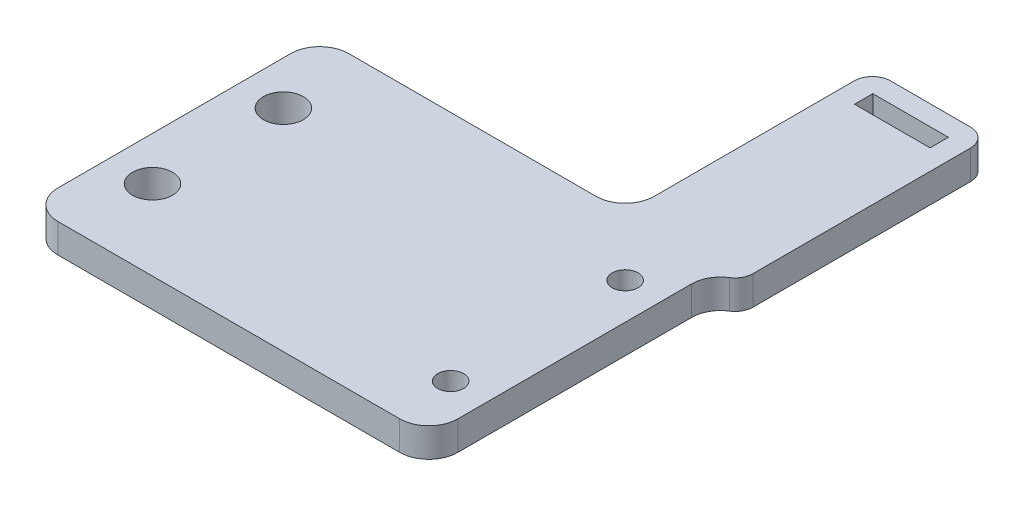
ISO-10303-21;
HEADER;
FILE_DESCRIPTION(('STEP AP214'),'2;1');
FILE_NAME('part.step','',(''),(''),'','','');
FILE_SCHEMA(('AUTOMOTIVE_DESIGN { 1 0 10303 214 1 1 1 1 }'));
ENDSEC;
DATA;
#1=APPLICATION_CONTEXT('core data for automotive mechanical design processes');
#2=APPLICATION_PROTOCOL_DEFINITION('international standard','automotive_design',2000,#1);
#3=PRODUCT_CONTEXT('',#1,'mechanical');
#4=PRODUCT('Part','Part','',(#3));
#5=PRODUCT_RELATED_PRODUCT_CATEGORY('part','',(#4));
#6=PRODUCT_DEFINITION_FORMATION('','',#4);
#7=PRODUCT_DEFINITION_CONTEXT('part definition',#1,'design');
#8=PRODUCT_DEFINITION('design','',#6,#7);
#9=PRODUCT_DEFINITION_SHAPE('','',#8);
#10=(LENGTH_UNIT() NAMED_UNIT(*) SI_UNIT(.MILLI.,.METRE.));
#11=(NAMED_UNIT(*) PLANE_ANGLE_UNIT() SI_UNIT($,.RADIAN.));
#12=(NAMED_UNIT(*) SI_UNIT($,.STERADIAN.) SOLID_ANGLE_UNIT());
#13=UNCERTAINTY_MEASURE_WITH_UNIT(LENGTH_MEASURE(1.E-05),#10,'distance_accuracy_value','');
#14=(GEOMETRIC_REPRESENTATION_CONTEXT(3) GLOBAL_UNCERTAINTY_ASSIGNED_CONTEXT((#13)) GLOBAL_UNIT_ASSIGNED_CONTEXT((#10,
#11,#12)) REPRESENTATION_CONTEXT('',''));
#15=CARTESIAN_POINT('',(0.,0.,0.));
#16=DIRECTION('',(0.,0.,1.));
#17=DIRECTION('',(1.,0.,0.));
#18=AXIS2_PLACEMENT_3D('',#15,#16,#17);
#19=CARTESIAN_POINT('',(0.,2.54,-25.4));
#20=DIRECTION('',(0.,0.,1.));
#21=DIRECTION('',(1.,0.,0.));
#22=AXIS2_PLACEMENT_3D('',#19,#20,#21);
#23=PLANE('',#22);
#24=DIRECTION('',(-1.,0.,0.));
#25=VECTOR('',#24,1.);
#26=CARTESIAN_POINT('',(0.,0.,-25.4));
#27=LINE('',#26,#25);
#28=CARTESIAN_POINT('',(24.13,0.,-25.4));
#29=VERTEX_POINT('',#28);
#30=CARTESIAN_POINT('',(2.54,0.,-25.4));
#31=VERTEX_POINT('',#30);
#32=EDGE_CURVE('E245',#29,#31,#27,.T.);
#33=ORIENTED_EDGE('',*,*,#32,.T.);
#34=DIRECTION('',(0.,-1.,0.));
#35=VECTOR('',#34,1.);
#36=CARTESIAN_POINT('',(2.54,2.54,-25.4));
#37=LINE('',#36,#35);
#38=CARTESIAN_POINT('',(2.54,2.54,-25.4));
#39=VERTEX_POINT('',#38);
#40=EDGE_CURVE('E41',#31,#39,#37,.F.);
#41=ORIENTED_EDGE('',*,*,#40,.T.);
#42=DIRECTION('',(-1.,0.,0.));
#43=VECTOR('',#42,1.);
#44=CARTESIAN_POINT('',(0.,2.54,-25.4));
#45=LINE('',#44,#43);
#46=CARTESIAN_POINT('',(24.13,2.54,-25.4));
#47=VERTEX_POINT('',#46);
#48=EDGE_CURVE('E250',#47,#39,#45,.T.);
#49=ORIENTED_EDGE('',*,*,#48,.F.);
#50=DIRECTION('',(0.,1.,0.));
#51=VECTOR('',#50,1.);
#52=CARTESIAN_POINT('',(24.13,2.54,-25.4));
#53=LINE('',#52,#51);
#54=EDGE_CURVE('E268',#47,#29,#53,.F.);
#55=ORIENTED_EDGE('',*,*,#54,.T.);
#56=EDGE_LOOP('',(#33,#41,#49,#55));
#57=FACE_BOUND('',#56,.T.);
#58=ADVANCED_FACE('F33',(#57),#23,.F.);
#59=CARTESIAN_POINT('',(0.,2.54,0.));
#60=DIRECTION('',(1.,0.,0.));
#61=DIRECTION('',(0.,0.,-1.));
#62=AXIS2_PLACEMENT_3D('',#59,#60,#61);
#63=PLANE('',#62);
#64=DIRECTION('',(0.,0.,1.));
#65=VECTOR('',#64,1.);
#66=CARTESIAN_POINT('',(0.,0.,0.));
#67=LINE('',#66,#65);
#68=CARTESIAN_POINT('',(0.,0.,-22.86));
#69=VERTEX_POINT('',#68);
#70=CARTESIAN_POINT('',(0.,0.,-2.54));
#71=VERTEX_POINT('',#70);
#72=EDGE_CURVE('E240',#69,#71,#67,.T.);
#73=ORIENTED_EDGE('',*,*,#72,.T.);
#74=DIRECTION('',(0.,-1.,0.));
#75=VECTOR('',#74,1.);
#76=CARTESIAN_POINT('',(0.,2.54,-2.54));
#77=LINE('',#76,#75);
#78=CARTESIAN_POINT('',(0.,2.54,-2.54));
#79=VERTEX_POINT('',#78);
#80=EDGE_CURVE('E322',#71,#79,#77,.F.);
#81=ORIENTED_EDGE('',*,*,#80,.T.);
#82=DIRECTION('',(0.,0.,1.));
#83=VECTOR('',#82,1.);
#84=CARTESIAN_POINT('',(0.,2.54,0.));
#85=LINE('',#84,#83);
#86=CARTESIAN_POINT('',(0.,2.54,-22.86));
#87=VERTEX_POINT('',#86);
#88=EDGE_CURVE('E241',#87,#79,#85,.T.);
#89=ORIENTED_EDGE('',*,*,#88,.F.);
#90=DIRECTION('',(0.,-1.,0.));
#91=VECTOR('',#90,1.);
#92=CARTESIAN_POINT('',(0.,2.54,-22.86));
#93=LINE('',#92,#91);
#94=EDGE_CURVE('E319',#87,#69,#93,.T.);
#95=ORIENTED_EDGE('',*,*,#94,.T.);
#96=EDGE_LOOP('',(#73,#81,#89,#95));
#97=FACE_BOUND('',#96,.T.);
#98=ADVANCED_FACE('F344',(#97),#63,.F.);
#99=CARTESIAN_POINT('',(0.,2.54,0.));
#100=DIRECTION('',(0.,0.,-1.));
#101=DIRECTION('',(-1.,0.,0.));
#102=AXIS2_PLACEMENT_3D('',#99,#100,#101);
#103=PLANE('',#102);
#104=DIRECTION('',(1.,0.,0.));
#105=VECTOR('',#104,1.);
#106=CARTESIAN_POINT('',(0.,2.54,0.));
#107=LINE('',#106,#105);
#108=CARTESIAN_POINT('',(2.54,2.54,0.));
#109=VERTEX_POINT('',#108);
#110=CARTESIAN_POINT('',(32.385,2.54,0.));
#111=VERTEX_POINT('',#110);
#112=EDGE_CURVE('E244',#109,#111,#107,.T.);
#113=ORIENTED_EDGE('',*,*,#112,.F.);
#114=DIRECTION('',(0.,-1.,0.));
#115=VECTOR('',#114,1.);
#116=CARTESIAN_POINT('',(2.54,2.54,0.));
#117=LINE('',#116,#115);
#118=CARTESIAN_POINT('',(2.54,0.,0.));
#119=VERTEX_POINT('',#118);
#120=EDGE_CURVE('E310',#109,#119,#117,.T.);
#121=ORIENTED_EDGE('',*,*,#120,.T.);
#122=DIRECTION('',(1.,0.,0.));
#123=VECTOR('',#122,1.);
#124=CARTESIAN_POINT('',(0.,0.,0.));
#125=LINE('',#124,#123);
#126=CARTESIAN_POINT('',(32.385,0.,0.));
#127=VERTEX_POINT('',#126);
#128=EDGE_CURVE('E256',#119,#127,#125,.T.);
#129=ORIENTED_EDGE('',*,*,#128,.T.);
#130=DIRECTION('',(0.,-1.,0.));
#131=VECTOR('',#130,1.);
#132=CARTESIAN_POINT('',(32.385,2.54,0.));
#133=LINE('',#132,#131);
#134=EDGE_CURVE('E308',#127,#111,#133,.F.);
#135=ORIENTED_EDGE('',*,*,#134,.T.);
#136=EDGE_LOOP('',(#113,#121,#129,#135));
#137=FACE_BOUND('',#136,.T.);
#138=ADVANCED_FACE('F354',(#137),#103,.F.);
#139=CARTESIAN_POINT('',(34.925,2.54,0.));
#140=DIRECTION('',(-1.,0.,0.));
#141=DIRECTION('',(0.,0.,1.));
#142=AXIS2_PLACEMENT_3D('',#139,#140,#141);
#143=PLANE('',#142);
#144=DIRECTION('',(0.,0.,-1.));
#145=VECTOR('',#144,1.);
#146=CARTESIAN_POINT('',(34.925,2.54,0.));
#147=LINE('',#146,#145);
#148=CARTESIAN_POINT('',(34.925,2.54,-2.54));
#149=VERTEX_POINT('',#148);
#150=CARTESIAN_POINT('',(34.925,2.54,-22.9406555751583));
#151=VERTEX_POINT('',#150);
#152=EDGE_CURVE('E248',#149,#151,#147,.T.);
#153=ORIENTED_EDGE('',*,*,#152,.F.);
#154=DIRECTION('',(0.,-1.,0.));
#155=VECTOR('',#154,1.);
#156=CARTESIAN_POINT('',(34.925,2.54,-2.54));
#157=LINE('',#156,#155);
#158=CARTESIAN_POINT('',(34.925,0.,-2.54));
#159=VERTEX_POINT('',#158);
#160=EDGE_CURVE('E11',#149,#159,#157,.T.);
#161=ORIENTED_EDGE('',*,*,#160,.T.);
#162=DIRECTION('',(0.,0.,-1.));
#163=VECTOR('',#162,1.);
#164=CARTESIAN_POINT('',(34.925,0.,0.));
#165=LINE('',#164,#163);
#166=CARTESIAN_POINT('',(34.925,0.,-22.9406555751583));
#167=VERTEX_POINT('',#166);
#168=EDGE_CURVE('E259',#159,#167,#165,.T.);
#169=ORIENTED_EDGE('',*,*,#168,.T.);
#170=DIRECTION('',(0.,1.,0.));
#171=VECTOR('',#170,1.);
#172=CARTESIAN_POINT('',(34.925,2.54,-22.9406555751583));
#173=LINE('',#172,#171);
#174=EDGE_CURVE('E253',#167,#151,#173,.T.);
#175=ORIENTED_EDGE('',*,*,#174,.T.);
#176=EDGE_LOOP('',(#153,#161,#169,#175));
#177=FACE_BOUND('',#176,.T.);
#178=ADVANCED_FACE('F362',(#177),#143,.F.);
#179=CARTESIAN_POINT('',(0.,2.54,0.));
#180=DIRECTION('',(0.,-1.,0.));
#181=DIRECTION('',(0.,0.,-1.));
#182=AXIS2_PLACEMENT_3D('',#179,#180,#181);
#183=PLANE('',#182);
#184=DIRECTION('',(-1.,0.,0.));
#185=VECTOR('',#184,1.);
#186=CARTESIAN_POINT('',(28.4513503624902,2.54,-45.2501));
#187=LINE('',#186,#185);
#188=CARTESIAN_POINT('',(35.0486496375098,2.54,-45.2501));
#189=VERTEX_POINT('',#188);
#190=CARTESIAN_POINT('',(28.4513503624902,2.54,-45.2501));
#191=VERTEX_POINT('',#190);
#192=EDGE_CURVE('E191',#189,#191,#187,.T.);
#193=ORIENTED_EDGE('',*,*,#192,.F.);
#194=DIRECTION('',(0.,0.,-1.));
#195=VECTOR('',#194,1.);
#196=CARTESIAN_POINT('',(35.0486496375098,2.54,-45.2501));
#197=LINE('',#196,#195);
#198=CARTESIAN_POINT('',(35.0486496375098,2.54,-43.6499));
#199=VERTEX_POINT('',#198);
#200=EDGE_CURVE('E48',#199,#189,#197,.T.);
#201=ORIENTED_EDGE('',*,*,#200,.F.);
#202=DIRECTION('',(1.,0.,0.));
#203=VECTOR('',#202,1.);
#204=CARTESIAN_POINT('',(28.4513503624902,2.54,-43.6499));
#205=LINE('',#204,#203);
#206=CARTESIAN_POINT('',(28.4513503624902,2.54,-43.6499));
#207=VERTEX_POINT('',#206);
#208=EDGE_CURVE('E182',#207,#199,#205,.T.);
#209=ORIENTED_EDGE('',*,*,#208,.F.);
#210=DIRECTION('',(0.,0.,1.));
#211=VECTOR('',#210,1.);
#212=CARTESIAN_POINT('',(28.4513503624902,2.54,-45.2501));
#213=LINE('',#212,#211);
#214=EDGE_CURVE('E185',#191,#207,#213,.T.);
#215=ORIENTED_EDGE('',*,*,#214,.F.);
#216=EDGE_LOOP('',(#193,#201,#209,#215));
#217=FACE_BOUND('',#216,.T.);
#218=CARTESIAN_POINT('',(31.75,2.54,-20.32));
#219=DIRECTION('',(0.,1.,0.));
#220=DIRECTION('',(0.,0.,1.));
#221=AXIS2_PLACEMENT_3D('',#218,#219,#220);
#222=CIRCLE('',#221,1.1303);
#223=CARTESIAN_POINT('',(31.75,2.54,-19.1897));
#224=VERTEX_POINT('',#223);
#225=EDGE_CURVE('E221',#224,#224,#222,.T.);
#226=ORIENTED_EDGE('',*,*,#225,.F.);
#227=EDGE_LOOP('',(#226));
#228=FACE_BOUND('',#227,.T.);
#229=CARTESIAN_POINT('',(31.75,2.54,-5.08));
#230=DIRECTION('',(0.,1.,0.));
#231=DIRECTION('',(0.,0.,-1.));
#232=AXIS2_PLACEMENT_3D('',#229,#230,#231);
#233=CIRCLE('',#232,1.1303);
#234=CARTESIAN_POINT('',(31.75,2.54,-6.2103));
#235=VERTEX_POINT('',#234);
#236=EDGE_CURVE('E210',#235,#235,#233,.T.);
#237=ORIENTED_EDGE('',*,*,#236,.F.);
#238=EDGE_LOOP('',(#237));
#239=FACE_BOUND('',#238,.T.);
#240=CARTESIAN_POINT('',(3.81,2.54,-18.415));
#241=DIRECTION('',(0.,-1.,0.));
#242=DIRECTION('',(0.,0.,-1.));
#243=AXIS2_PLACEMENT_3D('',#240,#241,#242);
#244=CIRCLE('',#243,1.74625);
#245=CARTESIAN_POINT('',(3.81,2.54,-20.16125));
#246=VERTEX_POINT('',#245);
#247=EDGE_CURVE('E237',#246,#246,#244,.F.);
#248=ORIENTED_EDGE('',*,*,#247,.F.);
#249=EDGE_LOOP('',(#248));
#250=FACE_BOUND('',#249,.T.);
#251=CARTESIAN_POINT('',(3.81,2.54,-6.985));
#252=DIRECTION('',(0.,-1.,0.));
#253=DIRECTION('',(0.,0.,-1.));
#254=AXIS2_PLACEMENT_3D('',#251,#252,#253);
#255=CIRCLE('',#254,1.74625);
#256=CARTESIAN_POINT('',(3.81,2.54,-8.73125));
#257=VERTEX_POINT('',#256);
#258=EDGE_CURVE('E232',#257,#257,#255,.F.);
#259=ORIENTED_EDGE('',*,*,#258,.F.);
#260=EDGE_LOOP('',(#259));
#261=FACE_BOUND('',#260,.T.);
#262=ORIENTED_EDGE('',*,*,#88,.T.);
#263=CARTESIAN_POINT('',(2.54,2.54,-2.54));
#264=DIRECTION('',(0.,-1.,0.));
#265=DIRECTION('',(0.,0.,-1.));
#266=AXIS2_PLACEMENT_3D('',#263,#264,#265);
#267=CIRCLE('',#266,2.54);
#268=EDGE_CURVE('E328',#79,#109,#267,.F.);
#269=ORIENTED_EDGE('',*,*,#268,.T.);
#270=ORIENTED_EDGE('',*,*,#112,.T.);
#271=CARTESIAN_POINT('',(32.385,2.54,-2.54));
#272=DIRECTION('',(0.,-1.,0.));
#273=DIRECTION('',(0.,0.,-1.));
#274=AXIS2_PLACEMENT_3D('',#271,#272,#273);
#275=CIRCLE('',#274,2.54);
#276=EDGE_CURVE('E324',#111,#149,#275,.F.);
#277=ORIENTED_EDGE('',*,*,#276,.T.);
#278=ORIENTED_EDGE('',*,*,#152,.T.);
#279=CARTESIAN_POINT('',(37.465,2.54,-22.9406555751583));
#280=DIRECTION('',(0.,-1.,0.));
#281=DIRECTION('',(0.,0.,-1.));
#282=AXIS2_PLACEMENT_3D('',#279,#280,#281);
#283=CIRCLE('',#282,2.54);
#284=CARTESIAN_POINT('',(36.0973076923077,2.54,-25.0809867998708));
#285=VERTEX_POINT('',#284);
#286=EDGE_CURVE('E273',#151,#285,#283,.T.);
#287=ORIENTED_EDGE('',*,*,#286,.T.);
#288=CARTESIAN_POINT('',(35.2425,2.54,-26.4186938153161));
#289=DIRECTION('',(0.,-1.,0.));
#290=DIRECTION('',(0.,0.,-1.));
#291=AXIS2_PLACEMENT_3D('',#288,#289,#290);
#292=CIRCLE('',#291,1.5875);
#293=CARTESIAN_POINT('',(36.83,2.54,-26.4186938153161));
#294=VERTEX_POINT('',#293);
#295=EDGE_CURVE('E286',#285,#294,#292,.F.);
#296=ORIENTED_EDGE('',*,*,#295,.T.);
#297=DIRECTION('',(0.,0.,-1.));
#298=VECTOR('',#297,1.);
#299=CARTESIAN_POINT('',(36.83,2.54,-46.99));
#300=LINE('',#299,#298);
#301=CARTESIAN_POINT('',(36.83,2.54,-45.4025));
#302=VERTEX_POINT('',#301);
#303=EDGE_CURVE('E212',#294,#302,#300,.T.);
#304=ORIENTED_EDGE('',*,*,#303,.T.);
#305=CARTESIAN_POINT('',(35.2425,2.54,-45.4025));
#306=DIRECTION('',(0.,-1.,0.));
#307=DIRECTION('',(0.,0.,-1.));
#308=AXIS2_PLACEMENT_3D('',#305,#306,#307);
#309=CIRCLE('',#308,1.5875);
#310=CARTESIAN_POINT('',(35.2425,2.54,-46.99));
#311=VERTEX_POINT('',#310);
#312=EDGE_CURVE('E290',#302,#311,#309,.F.);
#313=ORIENTED_EDGE('',*,*,#312,.T.);
#314=DIRECTION('',(-1.,0.,0.));
#315=VECTOR('',#314,1.);
#316=CARTESIAN_POINT('',(36.83,2.54,-46.99));
#317=LINE('',#316,#315);
#318=CARTESIAN_POINT('',(28.2575,2.54,-46.99));
#319=VERTEX_POINT('',#318);
#320=EDGE_CURVE('E204',#311,#319,#317,.T.);
#321=ORIENTED_EDGE('',*,*,#320,.T.);
#322=CARTESIAN_POINT('',(28.2575,2.54,-45.4025));
#323=DIRECTION('',(0.,-1.,0.));
#324=DIRECTION('',(0.,0.,-1.));
#325=AXIS2_PLACEMENT_3D('',#322,#323,#324);
#326=CIRCLE('',#325,1.5875);
#327=CARTESIAN_POINT('',(26.67,2.54,-45.4025));
#328=VERTEX_POINT('',#327);
#329=EDGE_CURVE('E288',#319,#328,#326,.F.);
#330=ORIENTED_EDGE('',*,*,#329,.T.);
#331=DIRECTION('',(0.,0.,1.));
#332=VECTOR('',#331,1.);
#333=CARTESIAN_POINT('',(26.67,2.54,-46.99));
#334=LINE('',#333,#332);
#335=CARTESIAN_POINT('',(26.67,2.54,-27.94));
#336=VERTEX_POINT('',#335);
#337=EDGE_CURVE('E197',#328,#336,#334,.T.);
#338=ORIENTED_EDGE('',*,*,#337,.T.);
#339=CARTESIAN_POINT('',(24.13,2.54,-27.94));
#340=DIRECTION('',(0.,-1.,0.));
#341=DIRECTION('',(0.,0.,-1.));
#342=AXIS2_PLACEMENT_3D('',#339,#340,#341);
#343=CIRCLE('',#342,2.54);
#344=EDGE_CURVE('E276',#336,#47,#343,.T.);
#345=ORIENTED_EDGE('',*,*,#344,.T.);
#346=ORIENTED_EDGE('',*,*,#48,.T.);
#347=CARTESIAN_POINT('',(2.54,2.54,-22.86));
#348=DIRECTION('',(0.,-1.,0.));
#349=DIRECTION('',(0.,0.,-1.));
#350=AXIS2_PLACEMENT_3D('',#347,#348,#349);
#351=CIRCLE('',#350,2.54);
#352=EDGE_CURVE('E326',#39,#87,#351,.F.);
#353=ORIENTED_EDGE('',*,*,#352,.T.);
#354=EDGE_LOOP('',(#262,#269,#270,#277,#278,#287,#296,#304,#313,#321,#330,#338,#345,#346,#353));
#355=FACE_BOUND('',#354,.T.);
#356=ADVANCED_FACE('F337',(#217,#228,#239,#250,#261,#355),#183,.F.);
#357=CARTESIAN_POINT('',(0.,0.,0.));
#358=DIRECTION('',(0.,-1.,0.));
#359=DIRECTION('',(0.,0.,-1.));
#360=AXIS2_PLACEMENT_3D('',#357,#358,#359);
#361=PLANE('',#360);
#362=DIRECTION('',(0.,0.,-1.));
#363=VECTOR('',#362,1.);
#364=CARTESIAN_POINT('',(35.0486496375098,0.,-45.2501));
#365=LINE('',#364,#363);
#366=CARTESIAN_POINT('',(35.0486496375098,0.,-43.6499));
#367=VERTEX_POINT('',#366);
#368=CARTESIAN_POINT('',(35.0486496375098,0.,-45.2501));
#369=VERTEX_POINT('',#368);
#370=EDGE_CURVE('E166',#367,#369,#365,.T.);
#371=ORIENTED_EDGE('',*,*,#370,.T.);
#372=DIRECTION('',(-1.,0.,0.));
#373=VECTOR('',#372,1.);
#374=CARTESIAN_POINT('',(28.4513503624902,0.,-45.2501));
#375=LINE('',#374,#373);
#376=CARTESIAN_POINT('',(28.4513503624902,0.,-45.2501));
#377=VERTEX_POINT('',#376);
#378=EDGE_CURVE('E175',#369,#377,#375,.T.);
#379=ORIENTED_EDGE('',*,*,#378,.T.);
#380=DIRECTION('',(0.,0.,1.));
#381=VECTOR('',#380,1.);
#382=CARTESIAN_POINT('',(28.4513503624902,0.,-45.2501));
#383=LINE('',#382,#381);
#384=CARTESIAN_POINT('',(28.4513503624902,0.,-43.6499));
#385=VERTEX_POINT('',#384);
#386=EDGE_CURVE('E56',#377,#385,#383,.T.);
#387=ORIENTED_EDGE('',*,*,#386,.T.);
#388=DIRECTION('',(1.,0.,0.));
#389=VECTOR('',#388,1.);
#390=CARTESIAN_POINT('',(28.4513503624902,0.,-43.6499));
#391=LINE('',#390,#389);
#392=EDGE_CURVE('E172',#385,#367,#391,.T.);
#393=ORIENTED_EDGE('',*,*,#392,.T.);
#394=EDGE_LOOP('',(#371,#379,#387,#393));
#395=FACE_BOUND('',#394,.T.);
#396=CARTESIAN_POINT('',(31.75,0.,-20.32));
#397=DIRECTION('',(0.,1.,0.));
#398=DIRECTION('',(0.,0.,1.));
#399=AXIS2_PLACEMENT_3D('',#396,#397,#398);
#400=CIRCLE('',#399,1.1303);
#401=CARTESIAN_POINT('',(31.75,0.,-19.1897));
#402=VERTEX_POINT('',#401);
#403=EDGE_CURVE('E217',#402,#402,#400,.T.);
#404=ORIENTED_EDGE('',*,*,#403,.T.);
#405=EDGE_LOOP('',(#404));
#406=FACE_BOUND('',#405,.T.);
#407=CARTESIAN_POINT('',(31.75,0.,-5.08));
#408=DIRECTION('',(0.,1.,0.));
#409=DIRECTION('',(0.,0.,-1.));
#410=AXIS2_PLACEMENT_3D('',#407,#408,#409);
#411=CIRCLE('',#410,1.1303);
#412=CARTESIAN_POINT('',(31.75,0.,-6.2103));
#413=VERTEX_POINT('',#412);
#414=EDGE_CURVE('E224',#413,#413,#411,.T.);
#415=ORIENTED_EDGE('',*,*,#414,.T.);
#416=EDGE_LOOP('',(#415));
#417=FACE_BOUND('',#416,.T.);
#418=CARTESIAN_POINT('',(3.81,0.,-18.415));
#419=DIRECTION('',(0.,1.,0.));
#420=DIRECTION('',(0.,0.,1.));
#421=AXIS2_PLACEMENT_3D('',#418,#419,#420);
#422=CIRCLE('',#421,1.74625);
#423=CARTESIAN_POINT('',(3.81,0.,-20.16125));
#424=VERTEX_POINT('',#423);
#425=EDGE_CURVE('E229',#424,#424,#422,.T.);
#426=ORIENTED_EDGE('',*,*,#425,.T.);
#427=EDGE_LOOP('',(#426));
#428=FACE_BOUND('',#427,.T.);
#429=CARTESIAN_POINT('',(3.81,0.,-6.985));
#430=DIRECTION('',(0.,1.,0.));
#431=DIRECTION('',(0.,0.,-1.));
#432=AXIS2_PLACEMENT_3D('',#429,#430,#431);
#433=CIRCLE('',#432,1.74625);
#434=CARTESIAN_POINT('',(3.81,0.,-8.73125));
#435=VERTEX_POINT('',#434);
#436=EDGE_CURVE('E220',#435,#435,#433,.T.);
#437=ORIENTED_EDGE('',*,*,#436,.T.);
#438=EDGE_LOOP('',(#437));
#439=FACE_BOUND('',#438,.T.);
#440=ORIENTED_EDGE('',*,*,#128,.F.);
#441=CARTESIAN_POINT('',(2.54,0.,-2.54));
#442=DIRECTION('',(0.,-1.,0.));
#443=DIRECTION('',(0.,0.,-1.));
#444=AXIS2_PLACEMENT_3D('',#441,#442,#443);
#445=CIRCLE('',#444,2.54);
#446=EDGE_CURVE('E317',#119,#71,#445,.T.);
#447=ORIENTED_EDGE('',*,*,#446,.T.);
#448=ORIENTED_EDGE('',*,*,#72,.F.);
#449=CARTESIAN_POINT('',(2.54,0.,-22.86));
#450=DIRECTION('',(0.,-1.,0.));
#451=DIRECTION('',(0.,0.,-1.));
#452=AXIS2_PLACEMENT_3D('',#449,#450,#451);
#453=CIRCLE('',#452,2.54);
#454=EDGE_CURVE('E315',#69,#31,#453,.T.);
#455=ORIENTED_EDGE('',*,*,#454,.T.);
#456=ORIENTED_EDGE('',*,*,#32,.F.);
#457=CARTESIAN_POINT('',(24.13,0.,-27.94));
#458=DIRECTION('',(0.,-1.,0.));
#459=DIRECTION('',(0.,0.,-1.));
#460=AXIS2_PLACEMENT_3D('',#457,#458,#459);
#461=CIRCLE('',#460,2.54);
#462=CARTESIAN_POINT('',(26.67,0.,-27.94));
#463=VERTEX_POINT('',#462);
#464=EDGE_CURVE('E278',#29,#463,#461,.F.);
#465=ORIENTED_EDGE('',*,*,#464,.T.);
#466=DIRECTION('',(0.,0.,1.));
#467=VECTOR('',#466,1.);
#468=CARTESIAN_POINT('',(26.67,0.,-46.99));
#469=LINE('',#468,#467);
#470=CARTESIAN_POINT('',(26.67,0.,-45.4025));
#471=VERTEX_POINT('',#470);
#472=EDGE_CURVE('E201',#471,#463,#469,.T.);
#473=ORIENTED_EDGE('',*,*,#472,.F.);
#474=CARTESIAN_POINT('',(28.2575,0.,-45.4025));
#475=DIRECTION('',(0.,-1.,0.));
#476=DIRECTION('',(0.,0.,-1.));
#477=AXIS2_PLACEMENT_3D('',#474,#475,#476);
#478=CIRCLE('',#477,1.5875);
#479=CARTESIAN_POINT('',(28.2575,0.,-46.99));
#480=VERTEX_POINT('',#479);
#481=EDGE_CURVE('E299',#471,#480,#478,.T.);
#482=ORIENTED_EDGE('',*,*,#481,.T.);
#483=DIRECTION('',(-1.,0.,0.));
#484=VECTOR('',#483,1.);
#485=CARTESIAN_POINT('',(36.83,0.,-46.99));
#486=LINE('',#485,#484);
#487=CARTESIAN_POINT('',(35.2425,0.,-46.99));
#488=VERTEX_POINT('',#487);
#489=EDGE_CURVE('E207',#488,#480,#486,.T.);
#490=ORIENTED_EDGE('',*,*,#489,.F.);
#491=CARTESIAN_POINT('',(35.2425,0.,-45.4025));
#492=DIRECTION('',(0.,-1.,0.));
#493=DIRECTION('',(0.,0.,-1.));
#494=AXIS2_PLACEMENT_3D('',#491,#492,#493);
#495=CIRCLE('',#494,1.5875);
#496=CARTESIAN_POINT('',(36.83,0.,-45.4025));
#497=VERTEX_POINT('',#496);
#498=EDGE_CURVE('E301',#488,#497,#495,.T.);
#499=ORIENTED_EDGE('',*,*,#498,.T.);
#500=DIRECTION('',(0.,0.,-1.));
#501=VECTOR('',#500,1.);
#502=CARTESIAN_POINT('',(36.83,0.,-46.99));
#503=LINE('',#502,#501);
#504=CARTESIAN_POINT('',(36.83,0.,-26.4186938153161));
#505=VERTEX_POINT('',#504);
#506=EDGE_CURVE('E203',#505,#497,#503,.T.);
#507=ORIENTED_EDGE('',*,*,#506,.F.);
#508=CARTESIAN_POINT('',(35.2425,0.,-26.4186938153161));
#509=DIRECTION('',(0.,-1.,0.));
#510=DIRECTION('',(0.,0.,-1.));
#511=AXIS2_PLACEMENT_3D('',#508,#509,#510);
#512=CIRCLE('',#511,1.5875);
#513=CARTESIAN_POINT('',(36.0973076923077,0.,-25.0809867998708));
#514=VERTEX_POINT('',#513);
#515=EDGE_CURVE('E297',#505,#514,#512,.T.);
#516=ORIENTED_EDGE('',*,*,#515,.T.);
#517=CARTESIAN_POINT('',(37.465,0.,-22.9406555751583));
#518=DIRECTION('',(0.,-1.,0.));
#519=DIRECTION('',(0.,0.,-1.));
#520=AXIS2_PLACEMENT_3D('',#517,#518,#519);
#521=CIRCLE('',#520,2.54);
#522=EDGE_CURVE('E270',#514,#167,#521,.F.);
#523=ORIENTED_EDGE('',*,*,#522,.T.);
#524=ORIENTED_EDGE('',*,*,#168,.F.);
#525=CARTESIAN_POINT('',(32.385,0.,-2.54));
#526=DIRECTION('',(0.,-1.,0.));
#527=DIRECTION('',(0.,0.,-1.));
#528=AXIS2_PLACEMENT_3D('',#525,#526,#527);
#529=CIRCLE('',#528,2.54);
#530=EDGE_CURVE('E313',#159,#127,#529,.T.);
#531=ORIENTED_EDGE('',*,*,#530,.T.);
#532=EDGE_LOOP('',(#440,#447,#448,#455,#456,#465,#473,#482,#490,#499,#507,#516,#523,#524,#531));
#533=FACE_BOUND('',#532,.T.);
#534=ADVANCED_FACE('F179',(#395,#406,#417,#428,#439,#533),#361,.T.);
#535=CARTESIAN_POINT('',(3.81,2.540012,-6.985));
#536=DIRECTION('',(0.,-1.,0.));
#537=DIRECTION('',(0.,0.,-1.));
#538=AXIS2_PLACEMENT_3D('',#535,#536,#537);
#539=CYLINDRICAL_SURFACE('',#538,1.74625);
#540=CARTESIAN_POINT('',(3.81,0.,-8.73125));
#541=CARTESIAN_POINT('',(3.81,0.0264583333333329,-8.73125));
#542=CARTESIAN_POINT('',(3.81,0.0529166666666662,-8.73125));
#543=CARTESIAN_POINT('',(3.81,0.105833333333333,-8.73125));
#544=CARTESIAN_POINT('',(3.81,0.132291666666666,-8.73125));
#545=CARTESIAN_POINT('',(3.81,0.185208333333333,-8.73125));
#546=CARTESIAN_POINT('',(3.81,0.211666666666666,-8.73125));
#547=CARTESIAN_POINT('',(3.81,0.264583333333333,-8.73125));
#548=CARTESIAN_POINT('',(3.81,0.291041666666666,-8.73125));
#549=CARTESIAN_POINT('',(3.81,0.343958333333333,-8.73125));
#550=CARTESIAN_POINT('',(3.81,0.370416666666666,-8.73125));
#551=CARTESIAN_POINT('',(3.81,0.423333333333333,-8.73125));
#552=CARTESIAN_POINT('',(3.81,0.449791666666666,-8.73125));
#553=CARTESIAN_POINT('',(3.81,0.502708333333333,-8.73125));
#554=CARTESIAN_POINT('',(3.81,0.529166666666666,-8.73125));
#555=CARTESIAN_POINT('',(3.81,0.582083333333333,-8.73125));
#556=CARTESIAN_POINT('',(3.81,0.608541666666666,-8.73125));
#557=CARTESIAN_POINT('',(3.81,0.661458333333333,-8.73125));
#558=CARTESIAN_POINT('',(3.81,0.687916666666666,-8.73125));
#559=CARTESIAN_POINT('',(3.81,0.740833333333333,-8.73125));
#560=CARTESIAN_POINT('',(3.81,0.767291666666666,-8.73125));
#561=CARTESIAN_POINT('',(3.81,0.820208333333333,-8.73125));
#562=CARTESIAN_POINT('',(3.81,0.846666666666666,-8.73125));
#563=CARTESIAN_POINT('',(3.81,0.899583333333333,-8.73125));
#564=CARTESIAN_POINT('',(3.81,0.926041666666666,-8.73125));
#565=CARTESIAN_POINT('',(3.81,0.978958333333333,-8.73125));
#566=CARTESIAN_POINT('',(3.81,1.00541666666667,-8.73125));
#567=CARTESIAN_POINT('',(3.81,1.05833333333333,-8.73125));
#568=CARTESIAN_POINT('',(3.81,1.08479166666667,-8.73125));
#569=CARTESIAN_POINT('',(3.81,1.13770833333333,-8.73125));
#570=CARTESIAN_POINT('',(3.81,1.16416666666667,-8.73125));
#571=CARTESIAN_POINT('',(3.81,1.21708333333333,-8.73125));
#572=CARTESIAN_POINT('',(3.81,1.24354166666667,-8.73125));
#573=CARTESIAN_POINT('',(3.81,1.29645833333333,-8.73125));
#574=CARTESIAN_POINT('',(3.81,1.32291666666667,-8.73125));
#575=CARTESIAN_POINT('',(3.81,1.37583333333333,-8.73125));
#576=CARTESIAN_POINT('',(3.81,1.40229166666667,-8.73125));
#577=CARTESIAN_POINT('',(3.81,1.45520833333333,-8.73125));
#578=CARTESIAN_POINT('',(3.81,1.48166666666667,-8.73125));
#579=CARTESIAN_POINT('',(3.81,1.53458333333333,-8.73125));
#580=CARTESIAN_POINT('',(3.81,1.56104166666667,-8.73125));
#581=CARTESIAN_POINT('',(3.81,1.61395833333333,-8.73125));
#582=CARTESIAN_POINT('',(3.81,1.64041666666667,-8.73125));
#583=CARTESIAN_POINT('',(3.81,1.69333333333333,-8.73125));
#584=CARTESIAN_POINT('',(3.81,1.71979166666667,-8.73125));
#585=CARTESIAN_POINT('',(3.81,1.77270833333333,-8.73125));
#586=CARTESIAN_POINT('',(3.81,1.79916666666667,-8.73125));
#587=CARTESIAN_POINT('',(3.81,1.85208333333333,-8.73125));
#588=CARTESIAN_POINT('',(3.81,1.87854166666667,-8.73125));
#589=CARTESIAN_POINT('',(3.81,1.93145833333333,-8.73125));
#590=CARTESIAN_POINT('',(3.81,1.95791666666667,-8.73125));
#591=CARTESIAN_POINT('',(3.81,2.01083333333333,-8.73125));
#592=CARTESIAN_POINT('',(3.81,2.03729166666667,-8.73125));
#593=CARTESIAN_POINT('',(3.81,2.09020833333333,-8.73125));
#594=CARTESIAN_POINT('',(3.81,2.11666666666667,-8.73125));
#595=CARTESIAN_POINT('',(3.81,2.16958333333333,-8.73125));
#596=CARTESIAN_POINT('',(3.81,2.19604166666667,-8.73125));
#597=CARTESIAN_POINT('',(3.81,2.24895833333333,-8.73125));
#598=CARTESIAN_POINT('',(3.81,2.27541666666667,-8.73125));
#599=CARTESIAN_POINT('',(3.81,2.32833333333333,-8.73125));
#600=CARTESIAN_POINT('',(3.81,2.35479166666667,-8.73125));
#601=CARTESIAN_POINT('',(3.81,2.40770833333333,-8.73125));
#602=CARTESIAN_POINT('',(3.81,2.43416666666667,-8.73125));
#603=CARTESIAN_POINT('',(3.81,2.48708333333333,-8.73125));
#604=CARTESIAN_POINT('',(3.81,2.51354166666667,-8.73125));
#605=CARTESIAN_POINT('',(3.81,2.54,-8.73125));
#606=B_SPLINE_CURVE_WITH_KNOTS('',3,(#540,#541,#542,#543,#544,#545,#546,#547,#548,#549,#550,
#551,#552,#553,#554,#555,#556,#557,#558,#559,#560,#561,#562,#563,#564,#565,#566,#567,#568,#569,
#570,#571,#572,#573,#574,#575,#576,#577,#578,#579,#580,#581,#582,#583,#584,#585,#586,#587,#588,
#589,#590,#591,#592,#593,#594,#595,#596,#597,#598,#599,#600,#601,#602,#603,#604,#605),
.UNSPECIFIED.,.F.,.F.,(4,2,2,2,2,2,2,2,2,2,2,2,2,2,2,2,2,2,2,2,2,2,2,2,2,2,2,2,2,2,2,2,4),(0.,
0.079375,0.15875,0.238125,0.3175,0.396875,0.47625,0.555625,0.635,0.714375,0.79375,0.873125,
0.9525,1.031875,1.11125,1.190625,1.27,1.349375,1.42875,1.508125,1.5875,1.666875,1.74625,
1.825625,1.905,1.984375,2.06375,2.143125,2.2225,2.301875,2.38125,2.460625,2.54),.UNSPECIFIED.);
#607=EDGE_CURVE('BSEAM446',#435,#257,#606,.T.);
#608=ORIENTED_EDGE('',*,*,#436,.F.);
#609=ORIENTED_EDGE('',*,*,#258,.T.);
#610=ORIENTED_EDGE('',*,*,#607,.T.);
#611=ORIENTED_EDGE('',*,*,#607,.F.);
#612=EDGE_LOOP('',(#608,#610,#609,#611));
#613=FACE_BOUND('',#612,.T.);
#614=ADVANCED_FACE('F446',(#613),#539,.F.);
#615=CARTESIAN_POINT('',(3.81,2.540012,-18.415));
#616=DIRECTION('',(0.,-1.,0.));
#617=DIRECTION('',(0.,0.,-1.));
#618=AXIS2_PLACEMENT_3D('',#615,#616,#617);
#619=CYLINDRICAL_SURFACE('',#618,1.74625);
#620=CARTESIAN_POINT('',(3.81,0.,-20.16125));
#621=CARTESIAN_POINT('',(3.81,0.0264583333333329,-20.16125));
#622=CARTESIAN_POINT('',(3.81,0.0529166666666662,-20.16125));
#623=CARTESIAN_POINT('',(3.81,0.105833333333333,-20.16125));
#624=CARTESIAN_POINT('',(3.81,0.132291666666666,-20.16125));
#625=CARTESIAN_POINT('',(3.81,0.185208333333333,-20.16125));
#626=CARTESIAN_POINT('',(3.81,0.211666666666666,-20.16125));
#627=CARTESIAN_POINT('',(3.81,0.264583333333333,-20.16125));
#628=CARTESIAN_POINT('',(3.81,0.291041666666666,-20.16125));
#629=CARTESIAN_POINT('',(3.81,0.343958333333333,-20.16125));
#630=CARTESIAN_POINT('',(3.81,0.370416666666666,-20.16125));
#631=CARTESIAN_POINT('',(3.81,0.423333333333333,-20.16125));
#632=CARTESIAN_POINT('',(3.81,0.449791666666666,-20.16125));
#633=CARTESIAN_POINT('',(3.81,0.502708333333333,-20.16125));
#634=CARTESIAN_POINT('',(3.81,0.529166666666666,-20.16125));
#635=CARTESIAN_POINT('',(3.81,0.582083333333333,-20.16125));
#636=CARTESIAN_POINT('',(3.81,0.608541666666666,-20.16125));
#637=CARTESIAN_POINT('',(3.81,0.661458333333333,-20.16125));
#638=CARTESIAN_POINT('',(3.81,0.687916666666666,-20.16125));
#639=CARTESIAN_POINT('',(3.81,0.740833333333333,-20.16125));
#640=CARTESIAN_POINT('',(3.81,0.767291666666666,-20.16125));
#641=CARTESIAN_POINT('',(3.81,0.820208333333333,-20.16125));
#642=CARTESIAN_POINT('',(3.81,0.846666666666666,-20.16125));
#643=CARTESIAN_POINT('',(3.81,0.899583333333333,-20.16125));
#644=CARTESIAN_POINT('',(3.81,0.926041666666666,-20.16125));
#645=CARTESIAN_POINT('',(3.81,0.978958333333333,-20.16125));
#646=CARTESIAN_POINT('',(3.81,1.00541666666667,-20.16125));
#647=CARTESIAN_POINT('',(3.81,1.05833333333333,-20.16125));
#648=CARTESIAN_POINT('',(3.81,1.08479166666667,-20.16125));
#649=CARTESIAN_POINT('',(3.81,1.13770833333333,-20.16125));
#650=CARTESIAN_POINT('',(3.81,1.16416666666667,-20.16125));
#651=CARTESIAN_POINT('',(3.81,1.21708333333333,-20.16125));
#652=CARTESIAN_POINT('',(3.81,1.24354166666667,-20.16125));
#653=CARTESIAN_POINT('',(3.81,1.29645833333333,-20.16125));
#654=CARTESIAN_POINT('',(3.81,1.32291666666667,-20.16125));
#655=CARTESIAN_POINT('',(3.81,1.37583333333333,-20.16125));
#656=CARTESIAN_POINT('',(3.81,1.40229166666667,-20.16125));
#657=CARTESIAN_POINT('',(3.81,1.45520833333333,-20.16125));
#658=CARTESIAN_POINT('',(3.81,1.48166666666667,-20.16125));
#659=CARTESIAN_POINT('',(3.81,1.53458333333333,-20.16125));
#660=CARTESIAN_POINT('',(3.81,1.56104166666667,-20.16125));
#661=CARTESIAN_POINT('',(3.81,1.61395833333333,-20.16125));
#662=CARTESIAN_POINT('',(3.81,1.64041666666667,-20.16125));
#663=CARTESIAN_POINT('',(3.81,1.69333333333333,-20.16125));
#664=CARTESIAN_POINT('',(3.81,1.71979166666667,-20.16125));
#665=CARTESIAN_POINT('',(3.81,1.77270833333333,-20.16125));
#666=CARTESIAN_POINT('',(3.81,1.79916666666667,-20.16125));
#667=CARTESIAN_POINT('',(3.81,1.85208333333333,-20.16125));
#668=CARTESIAN_POINT('',(3.81,1.87854166666667,-20.16125));
#669=CARTESIAN_POINT('',(3.81,1.93145833333333,-20.16125));
#670=CARTESIAN_POINT('',(3.81,1.95791666666667,-20.16125));
#671=CARTESIAN_POINT('',(3.81,2.01083333333333,-20.16125));
#672=CARTESIAN_POINT('',(3.81,2.03729166666667,-20.16125));
#673=CARTESIAN_POINT('',(3.81,2.09020833333333,-20.16125));
#674=CARTESIAN_POINT('',(3.81,2.11666666666667,-20.16125));
#675=CARTESIAN_POINT('',(3.81,2.16958333333333,-20.16125));
#676=CARTESIAN_POINT('',(3.81,2.19604166666667,-20.16125));
#677=CARTESIAN_POINT('',(3.81,2.24895833333333,-20.16125));
#678=CARTESIAN_POINT('',(3.81,2.27541666666667,-20.16125));
#679=CARTESIAN_POINT('',(3.81,2.32833333333333,-20.16125));
#680=CARTESIAN_POINT('',(3.81,2.35479166666667,-20.16125));
#681=CARTESIAN_POINT('',(3.81,2.40770833333333,-20.16125));
#682=CARTESIAN_POINT('',(3.81,2.43416666666667,-20.16125));
#683=CARTESIAN_POINT('',(3.81,2.48708333333333,-20.16125));
#684=CARTESIAN_POINT('',(3.81,2.51354166666667,-20.16125));
#685=CARTESIAN_POINT('',(3.81,2.54,-20.16125));
#686=B_SPLINE_CURVE_WITH_KNOTS('',3,(#620,#621,#622,#623,#624,#625,#626,#627,#628,#629,#630,
#631,#632,#633,#634,#635,#636,#637,#638,#639,#640,#641,#642,#643,#644,#645,#646,#647,#648,#649,
#650,#651,#652,#653,#654,#655,#656,#657,#658,#659,#660,#661,#662,#663,#664,#665,#666,#667,#668,
#669,#670,#671,#672,#673,#674,#675,#676,#677,#678,#679,#680,#681,#682,#683,#684,#685),
.UNSPECIFIED.,.F.,.F.,(4,2,2,2,2,2,2,2,2,2,2,2,2,2,2,2,2,2,2,2,2,2,2,2,2,2,2,2,2,2,2,2,4),(0.,
0.079375,0.15875,0.238125,0.3175,0.396875,0.47625,0.555625,0.635,0.714375,0.79375,0.873125,
0.9525,1.031875,1.11125,1.190625,1.27,1.349375,1.42875,1.508125,1.5875,1.666875,1.74625,
1.825625,1.905,1.984375,2.06375,2.143125,2.2225,2.301875,2.38125,2.460625,2.54),.UNSPECIFIED.);
#687=EDGE_CURVE('BSEAM442',#424,#246,#686,.T.);
#688=ORIENTED_EDGE('',*,*,#425,.F.);
#689=ORIENTED_EDGE('',*,*,#247,.T.);
#690=ORIENTED_EDGE('',*,*,#687,.T.);
#691=ORIENTED_EDGE('',*,*,#687,.F.);
#692=EDGE_LOOP('',(#688,#690,#689,#691));
#693=FACE_BOUND('',#692,.T.);
#694=ADVANCED_FACE('F442',(#693),#619,.F.);
#695=CARTESIAN_POINT('',(31.75,0.,-5.08));
#696=DIRECTION('',(0.,1.,0.));
#697=DIRECTION('',(0.,0.,1.));
#698=AXIS2_PLACEMENT_3D('',#695,#696,#697);
#699=CYLINDRICAL_SURFACE('',#698,1.1303);
#700=ORIENTED_EDGE('',*,*,#414,.F.);
#701=EDGE_LOOP('',(#700));
#702=FACE_BOUND('',#701,.T.);
#703=ORIENTED_EDGE('',*,*,#236,.T.);
#704=EDGE_LOOP('',(#703));
#705=FACE_BOUND('',#704,.T.);
#706=ADVANCED_FACE('F435',(#702,#705),#699,.F.);
#707=CARTESIAN_POINT('',(31.75,0.,-20.32));
#708=DIRECTION('',(0.,1.,0.));
#709=DIRECTION('',(0.,0.,1.));
#710=AXIS2_PLACEMENT_3D('',#707,#708,#709);
#711=CYLINDRICAL_SURFACE('',#710,1.1303);
#712=ORIENTED_EDGE('',*,*,#403,.F.);
#713=EDGE_LOOP('',(#712));
#714=FACE_BOUND('',#713,.T.);
#715=ORIENTED_EDGE('',*,*,#225,.T.);
#716=EDGE_LOOP('',(#715));
#717=FACE_BOUND('',#716,.T.);
#718=ADVANCED_FACE('F428',(#714,#717),#711,.F.);
#719=CARTESIAN_POINT('',(26.67,0.,-46.99));
#720=DIRECTION('',(-1.,0.,0.));
#721=DIRECTION('',(0.,0.,1.));
#722=AXIS2_PLACEMENT_3D('',#719,#720,#721);
#723=PLANE('',#722);
#724=ORIENTED_EDGE('',*,*,#337,.F.);
#725=DIRECTION('',(0.,1.,0.));
#726=VECTOR('',#725,1.);
#727=CARTESIAN_POINT('',(26.67,0.,-45.4025));
#728=LINE('',#727,#726);
#729=EDGE_CURVE('E303',#328,#471,#728,.F.);
#730=ORIENTED_EDGE('',*,*,#729,.T.);
#731=ORIENTED_EDGE('',*,*,#472,.T.);
#732=DIRECTION('',(0.,1.,0.));
#733=VECTOR('',#732,1.);
#734=CARTESIAN_POINT('',(26.67,0.,-27.94));
#735=LINE('',#734,#733);
#736=EDGE_CURVE('E265',#463,#336,#735,.T.);
#737=ORIENTED_EDGE('',*,*,#736,.T.);
#738=EDGE_LOOP('',(#724,#730,#731,#737));
#739=FACE_BOUND('',#738,.T.);
#740=ADVANCED_FACE('F424',(#739),#723,.T.);
#741=CARTESIAN_POINT('',(36.83,0.,-46.99));
#742=DIRECTION('',(0.,0.,-1.));
#743=DIRECTION('',(-1.,0.,0.));
#744=AXIS2_PLACEMENT_3D('',#741,#742,#743);
#745=PLANE('',#744);
#746=ORIENTED_EDGE('',*,*,#320,.F.);
#747=DIRECTION('',(0.,1.,0.));
#748=VECTOR('',#747,1.);
#749=CARTESIAN_POINT('',(35.2425,0.,-46.99));
#750=LINE('',#749,#748);
#751=EDGE_CURVE('E295',#311,#488,#750,.F.);
#752=ORIENTED_EDGE('',*,*,#751,.T.);
#753=ORIENTED_EDGE('',*,*,#489,.T.);
#754=DIRECTION('',(0.,1.,0.));
#755=VECTOR('',#754,1.);
#756=CARTESIAN_POINT('',(28.2575,0.,-46.99));
#757=LINE('',#756,#755);
#758=EDGE_CURVE('E292',#480,#319,#757,.T.);
#759=ORIENTED_EDGE('',*,*,#758,.T.);
#760=EDGE_LOOP('',(#746,#752,#753,#759));
#761=FACE_BOUND('',#760,.T.);
#762=ADVANCED_FACE('F420',(#761),#745,.T.);
#763=CARTESIAN_POINT('',(36.83,0.,-46.99));
#764=DIRECTION('',(1.,0.,0.));
#765=DIRECTION('',(0.,0.,-1.));
#766=AXIS2_PLACEMENT_3D('',#763,#764,#765);
#767=PLANE('',#766);
#768=ORIENTED_EDGE('',*,*,#506,.T.);
#769=DIRECTION('',(0.,1.,0.));
#770=VECTOR('',#769,1.);
#771=CARTESIAN_POINT('',(36.83,0.,-45.4025));
#772=LINE('',#771,#770);
#773=EDGE_CURVE('E283',#497,#302,#772,.T.);
#774=ORIENTED_EDGE('',*,*,#773,.T.);
#775=ORIENTED_EDGE('',*,*,#303,.F.);
#776=DIRECTION('',(0.,-1.,0.));
#777=VECTOR('',#776,1.);
#778=CARTESIAN_POINT('',(36.83,0.,-26.4186938153161));
#779=LINE('',#778,#777);
#780=EDGE_CURVE('E281',#294,#505,#779,.T.);
#781=ORIENTED_EDGE('',*,*,#780,.T.);
#782=EDGE_LOOP('',(#768,#774,#775,#781));
#783=FACE_BOUND('',#782,.T.);
#784=ADVANCED_FACE('F375',(#783),#767,.T.);
#785=CARTESIAN_POINT('',(37.465,0.,-22.9406555751583));
#786=DIRECTION('',(0.,1.,0.));
#787=DIRECTION('',(0.,0.,1.));
#788=AXIS2_PLACEMENT_3D('',#785,#786,#787);
#789=CYLINDRICAL_SURFACE('',#788,2.54);
#790=ORIENTED_EDGE('',*,*,#522,.F.);
#791=DIRECTION('',(0.,1.,0.));
#792=VECTOR('',#791,1.);
#793=CARTESIAN_POINT('',(36.0973076923077,0.,-25.0809867998708));
#794=LINE('',#793,#792);
#795=EDGE_CURVE('E305',#514,#285,#794,.T.);
#796=ORIENTED_EDGE('',*,*,#795,.T.);
#797=ORIENTED_EDGE('',*,*,#286,.F.);
#798=ORIENTED_EDGE('',*,*,#174,.F.);
#799=EDGE_LOOP('',(#790,#796,#797,#798));
#800=FACE_BOUND('',#799,.T.);
#801=ADVANCED_FACE('F370',(#800),#789,.F.);
#802=CARTESIAN_POINT('',(24.13,0.,-27.94));
#803=DIRECTION('',(0.,1.,0.));
#804=DIRECTION('',(0.,0.,1.));
#805=AXIS2_PLACEMENT_3D('',#802,#803,#804);
#806=CYLINDRICAL_SURFACE('',#805,2.54);
#807=ORIENTED_EDGE('',*,*,#464,.F.);
#808=ORIENTED_EDGE('',*,*,#54,.F.);
#809=ORIENTED_EDGE('',*,*,#344,.F.);
#810=ORIENTED_EDGE('',*,*,#736,.F.);
#811=EDGE_LOOP('',(#807,#808,#809,#810));
#812=FACE_BOUND('',#811,.T.);
#813=ADVANCED_FACE('F404',(#812),#806,.F.);
#814=CARTESIAN_POINT('',(35.2425,0.,-45.4025));
#815=DIRECTION('',(0.,1.,0.));
#816=DIRECTION('',(0.,0.,1.));
#817=AXIS2_PLACEMENT_3D('',#814,#815,#816);
#818=CYLINDRICAL_SURFACE('',#817,1.5875);
#819=ORIENTED_EDGE('',*,*,#498,.F.);
#820=ORIENTED_EDGE('',*,*,#751,.F.);
#821=ORIENTED_EDGE('',*,*,#312,.F.);
#822=ORIENTED_EDGE('',*,*,#773,.F.);
#823=EDGE_LOOP('',(#819,#820,#821,#822));
#824=FACE_BOUND('',#823,.T.);
#825=ADVANCED_FACE('F386',(#824),#818,.T.);
#826=CARTESIAN_POINT('',(28.2575,0.,-45.4025));
#827=DIRECTION('',(0.,1.,0.));
#828=DIRECTION('',(0.,0.,1.));
#829=AXIS2_PLACEMENT_3D('',#826,#827,#828);
#830=CYLINDRICAL_SURFACE('',#829,1.5875);
#831=ORIENTED_EDGE('',*,*,#481,.F.);
#832=ORIENTED_EDGE('',*,*,#729,.F.);
#833=ORIENTED_EDGE('',*,*,#329,.F.);
#834=ORIENTED_EDGE('',*,*,#758,.F.);
#835=EDGE_LOOP('',(#831,#832,#833,#834));
#836=FACE_BOUND('',#835,.T.);
#837=ADVANCED_FACE('F379',(#836),#830,.T.);
#838=CARTESIAN_POINT('',(35.2425,0.,-26.4186938153161));
#839=DIRECTION('',(0.,1.,0.));
#840=DIRECTION('',(0.,0.,1.));
#841=AXIS2_PLACEMENT_3D('',#838,#839,#840);
#842=CYLINDRICAL_SURFACE('',#841,1.5875);
#843=ORIENTED_EDGE('',*,*,#515,.F.);
#844=ORIENTED_EDGE('',*,*,#780,.F.);
#845=ORIENTED_EDGE('',*,*,#295,.F.);
#846=ORIENTED_EDGE('',*,*,#795,.F.);
#847=EDGE_LOOP('',(#843,#844,#845,#846));
#848=FACE_BOUND('',#847,.T.);
#849=ADVANCED_FACE('F377',(#848),#842,.T.);
#850=CARTESIAN_POINT('',(2.54,2.54,-2.54));
#851=DIRECTION('',(0.,-1.,0.));
#852=DIRECTION('',(0.,0.,-1.));
#853=AXIS2_PLACEMENT_3D('',#850,#851,#852);
#854=CYLINDRICAL_SURFACE('',#853,2.54);
#855=ORIENTED_EDGE('',*,*,#268,.F.);
#856=ORIENTED_EDGE('',*,*,#80,.F.);
#857=ORIENTED_EDGE('',*,*,#446,.F.);
#858=ORIENTED_EDGE('',*,*,#120,.F.);
#859=EDGE_LOOP('',(#855,#856,#857,#858));
#860=FACE_BOUND('',#859,.T.);
#861=ADVANCED_FACE('F351',(#860),#854,.T.);
#862=CARTESIAN_POINT('',(2.54,2.54,-22.86));
#863=DIRECTION('',(0.,-1.,0.));
#864=DIRECTION('',(0.,0.,-1.));
#865=AXIS2_PLACEMENT_3D('',#862,#863,#864);
#866=CYLINDRICAL_SURFACE('',#865,2.54);
#867=ORIENTED_EDGE('',*,*,#352,.F.);
#868=ORIENTED_EDGE('',*,*,#40,.F.);
#869=ORIENTED_EDGE('',*,*,#454,.F.);
#870=ORIENTED_EDGE('',*,*,#94,.F.);
#871=EDGE_LOOP('',(#867,#868,#869,#870));
#872=FACE_BOUND('',#871,.T.);
#873=ADVANCED_FACE('F341',(#872),#866,.T.);
#874=CARTESIAN_POINT('',(32.385,2.54,-2.54));
#875=DIRECTION('',(0.,-1.,0.));
#876=DIRECTION('',(0.,0.,-1.));
#877=AXIS2_PLACEMENT_3D('',#874,#875,#876);
#878=CYLINDRICAL_SURFACE('',#877,2.54);
#879=ORIENTED_EDGE('',*,*,#276,.F.);
#880=ORIENTED_EDGE('',*,*,#134,.F.);
#881=ORIENTED_EDGE('',*,*,#530,.F.);
#882=ORIENTED_EDGE('',*,*,#160,.F.);
#883=EDGE_LOOP('',(#879,#880,#881,#882));
#884=FACE_BOUND('',#883,.T.);
#885=ADVANCED_FACE('F35',(#884),#878,.T.);
#886=CARTESIAN_POINT('',(35.0486496375098,0.,-45.2501));
#887=DIRECTION('',(1.,0.,0.));
#888=DIRECTION('',(0.,0.,-1.));
#889=AXIS2_PLACEMENT_3D('',#886,#887,#888);
#890=PLANE('',#889);
#891=ORIENTED_EDGE('',*,*,#200,.T.);
#892=DIRECTION('',(0.,1.,0.));
#893=VECTOR('',#892,1.);
#894=CARTESIAN_POINT('',(35.0486496375098,0.,-45.2501));
#895=LINE('',#894,#893);
#896=EDGE_CURVE('E162',#369,#189,#895,.T.);
#897=ORIENTED_EDGE('',*,*,#896,.F.);
#898=ORIENTED_EDGE('',*,*,#370,.F.);
#899=DIRECTION('',(0.,1.,0.));
#900=VECTOR('',#899,1.);
#901=CARTESIAN_POINT('',(35.0486496375098,0.,-43.6499));
#902=LINE('',#901,#900);
#903=EDGE_CURVE('E195',#367,#199,#902,.T.);
#904=ORIENTED_EDGE('',*,*,#903,.T.);
#905=EDGE_LOOP('',(#891,#897,#898,#904));
#906=FACE_BOUND('',#905,.T.);
#907=ADVANCED_FACE('F164',(#906),#890,.F.);
#908=CARTESIAN_POINT('',(28.4513503624902,0.,-43.6499));
#909=DIRECTION('',(0.,0.,1.));
#910=DIRECTION('',(1.,0.,0.));
#911=AXIS2_PLACEMENT_3D('',#908,#909,#910);
#912=PLANE('',#911);
#913=ORIENTED_EDGE('',*,*,#208,.T.);
#914=ORIENTED_EDGE('',*,*,#903,.F.);
#915=ORIENTED_EDGE('',*,*,#392,.F.);
#916=DIRECTION('',(0.,1.,0.));
#917=VECTOR('',#916,1.);
#918=CARTESIAN_POINT('',(28.4513503624902,0.,-43.6499));
#919=LINE('',#918,#917);
#920=EDGE_CURVE('E198',#385,#207,#919,.T.);
#921=ORIENTED_EDGE('',*,*,#920,.T.);
#922=EDGE_LOOP('',(#913,#914,#915,#921));
#923=FACE_BOUND('',#922,.T.);
#924=ADVANCED_FACE('F471',(#923),#912,.F.);
#925=CARTESIAN_POINT('',(28.4513503624902,0.,-45.2501));
#926=DIRECTION('',(-1.,0.,0.));
#927=DIRECTION('',(0.,0.,1.));
#928=AXIS2_PLACEMENT_3D('',#925,#926,#927);
#929=PLANE('',#928);
#930=ORIENTED_EDGE('',*,*,#214,.T.);
#931=ORIENTED_EDGE('',*,*,#920,.F.);
#932=ORIENTED_EDGE('',*,*,#386,.F.);
#933=DIRECTION('',(0.,1.,0.));
#934=VECTOR('',#933,1.);
#935=CARTESIAN_POINT('',(28.4513503624902,0.,-45.2501));
#936=LINE('',#935,#934);
#937=EDGE_CURVE('E171',#377,#191,#936,.T.);
#938=ORIENTED_EDGE('',*,*,#937,.T.);
#939=EDGE_LOOP('',(#930,#931,#932,#938));
#940=FACE_BOUND('',#939,.T.);
#941=ADVANCED_FACE('F469',(#940),#929,.F.);
#942=CARTESIAN_POINT('',(28.4513503624902,0.,-45.2501));
#943=DIRECTION('',(0.,0.,-1.));
#944=DIRECTION('',(-1.,0.,0.));
#945=AXIS2_PLACEMENT_3D('',#942,#943,#944);
#946=PLANE('',#945);
#947=ORIENTED_EDGE('',*,*,#192,.T.);
#948=ORIENTED_EDGE('',*,*,#937,.F.);
#949=ORIENTED_EDGE('',*,*,#378,.F.);
#950=ORIENTED_EDGE('',*,*,#896,.T.);
#951=EDGE_LOOP('',(#947,#948,#949,#950));
#952=FACE_BOUND('',#951,.T.);
#953=ADVANCED_FACE('F176',(#952),#946,.F.);
#954=CLOSED_SHELL('',(#58,#98,#138,#178,#356,#534,#614,#694,#706,#718,#740,#762,#784,#801,#813,
#825,#837,#849,#861,#873,#885,#907,#924,#941,#953));
#955=MANIFOLD_SOLID_BREP('B2',#954);
#956=ADVANCED_BREP_SHAPE_REPRESENTATION('',(#18,#955),#14);
#957=SHAPE_DEFINITION_REPRESENTATION(#9,#956);
ENDSEC;
END-ISO-10303-21;
